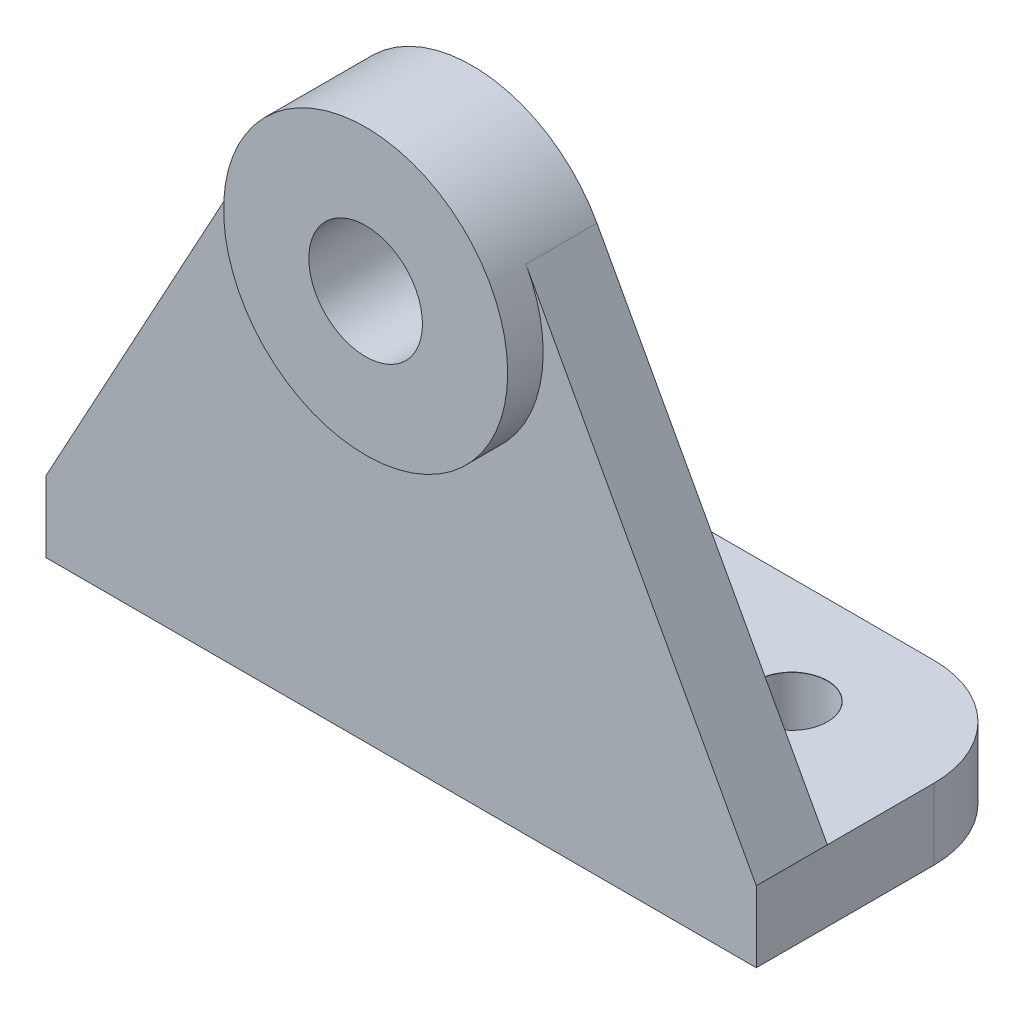
ISO-10303-21;
HEADER;
FILE_DESCRIPTION(('STEP AP214'),'2;1');
FILE_NAME('part.step','',(''),(''),'','','');
FILE_SCHEMA(('AUTOMOTIVE_DESIGN { 1 0 10303 214 1 1 1 1 }'));
ENDSEC;
DATA;
#1=APPLICATION_CONTEXT('core data for automotive mechanical design processes');
#2=APPLICATION_PROTOCOL_DEFINITION('international standard','automotive_design',2000,#1);
#3=PRODUCT_CONTEXT('',#1,'mechanical');
#4=PRODUCT('Part','Part','',(#3));
#5=PRODUCT_RELATED_PRODUCT_CATEGORY('part','',(#4));
#6=PRODUCT_DEFINITION_FORMATION('','',#4);
#7=PRODUCT_DEFINITION_CONTEXT('part definition',#1,'design');
#8=PRODUCT_DEFINITION('design','',#6,#7);
#9=PRODUCT_DEFINITION_SHAPE('','',#8);
#10=(LENGTH_UNIT() NAMED_UNIT(*) SI_UNIT(.MILLI.,.METRE.));
#11=(NAMED_UNIT(*) PLANE_ANGLE_UNIT() SI_UNIT($,.RADIAN.));
#12=(NAMED_UNIT(*) SI_UNIT($,.STERADIAN.) SOLID_ANGLE_UNIT());
#13=UNCERTAINTY_MEASURE_WITH_UNIT(LENGTH_MEASURE(1.E-05),#10,'distance_accuracy_value','');
#14=(GEOMETRIC_REPRESENTATION_CONTEXT(3) GLOBAL_UNCERTAINTY_ASSIGNED_CONTEXT((#13)) GLOBAL_UNIT_ASSIGNED_CONTEXT((#10,
#11,#12)) REPRESENTATION_CONTEXT('',''));
#15=CARTESIAN_POINT('',(0.,0.,0.));
#16=DIRECTION('',(0.,0.,1.));
#17=DIRECTION('',(1.,0.,0.));
#18=AXIS2_PLACEMENT_3D('',#15,#16,#17);
#19=CARTESIAN_POINT('',(0.,10.,0.));
#20=DIRECTION('',(0.,1.,0.));
#21=DIRECTION('',(0.,0.,1.));
#22=AXIS2_PLACEMENT_3D('',#19,#20,#21);
#23=PLANE('',#22);
#24=CARTESIAN_POINT('',(30.,10.,-5.));
#25=DIRECTION('',(0.,1.,0.));
#26=DIRECTION('',(0.,0.,1.));
#27=AXIS2_PLACEMENT_3D('',#24,#25,#26);
#28=CIRCLE('',#27,5.025);
#29=CARTESIAN_POINT('',(30.,10.,0.0250000000000007));
#30=VERTEX_POINT('',#29);
#31=EDGE_CURVE('E406',#30,#30,#28,.T.);
#32=ORIENTED_EDGE('',*,*,#31,.F.);
#33=EDGE_LOOP('',(#32));
#34=FACE_BOUND('',#33,.T.);
#35=CARTESIAN_POINT('',(-30.,10.,-5.));
#36=DIRECTION('',(0.,1.,0.));
#37=DIRECTION('',(0.,0.,1.));
#38=AXIS2_PLACEMENT_3D('',#35,#36,#37);
#39=CIRCLE('',#38,4.925);
#40=CARTESIAN_POINT('',(-30.,10.,-0.0750000000000021));
#41=VERTEX_POINT('',#40);
#42=EDGE_CURVE('E397',#41,#41,#39,.T.);
#43=ORIENTED_EDGE('',*,*,#42,.F.);
#44=EDGE_LOOP('',(#43));
#45=FACE_BOUND('',#44,.T.);
#46=DIRECTION('',(0.,0.,-1.));
#47=VECTOR('',#46,1.);
#48=CARTESIAN_POINT('',(50.,10.,20.));
#49=LINE('',#48,#47);
#50=CARTESIAN_POINT('',(50.,10.,10.));
#51=VERTEX_POINT('',#50);
#52=CARTESIAN_POINT('',(50.,10.,-5.00000000000001));
#53=VERTEX_POINT('',#52);
#54=EDGE_CURVE('E168',#51,#53,#49,.T.);
#55=ORIENTED_EDGE('',*,*,#54,.T.);
#56=CARTESIAN_POINT('',(35.,10.,-5.00000000000001));
#57=DIRECTION('',(0.,1.,0.));
#58=DIRECTION('',(0.,0.,1.));
#59=AXIS2_PLACEMENT_3D('',#56,#57,#58);
#60=CIRCLE('',#59,15.);
#61=CARTESIAN_POINT('',(35.,10.,-20.));
#62=VERTEX_POINT('',#61);
#63=EDGE_CURVE('E47',#53,#62,#60,.T.);
#64=ORIENTED_EDGE('',*,*,#63,.T.);
#65=DIRECTION('',(-1.,0.,0.));
#66=VECTOR('',#65,1.);
#67=CARTESIAN_POINT('',(50.,10.,-20.));
#68=LINE('',#67,#66);
#69=CARTESIAN_POINT('',(-35.,10.,-20.));
#70=VERTEX_POINT('',#69);
#71=EDGE_CURVE('E172',#62,#70,#68,.T.);
#72=ORIENTED_EDGE('',*,*,#71,.T.);
#73=CARTESIAN_POINT('',(-35.,10.,-5.));
#74=DIRECTION('',(0.,1.,0.));
#75=DIRECTION('',(0.,0.,1.));
#76=AXIS2_PLACEMENT_3D('',#73,#74,#75);
#77=CIRCLE('',#76,15.);
#78=CARTESIAN_POINT('',(-50.,10.,-5.));
#79=VERTEX_POINT('',#78);
#80=EDGE_CURVE('E54',#70,#79,#77,.T.);
#81=ORIENTED_EDGE('',*,*,#80,.T.);
#82=DIRECTION('',(0.,0.,1.));
#83=VECTOR('',#82,1.);
#84=CARTESIAN_POINT('',(-50.,10.,20.));
#85=LINE('',#84,#83);
#86=CARTESIAN_POINT('',(-50.,10.,10.));
#87=VERTEX_POINT('',#86);
#88=EDGE_CURVE('E166',#79,#87,#85,.T.);
#89=ORIENTED_EDGE('',*,*,#88,.T.);
#90=DIRECTION('',(1.,0.,0.));
#91=VECTOR('',#90,1.);
#92=CARTESIAN_POINT('',(-50.,10.,10.));
#93=LINE('',#92,#91);
#94=EDGE_CURVE('E153',#87,#51,#93,.T.);
#95=ORIENTED_EDGE('',*,*,#94,.T.);
#96=EDGE_LOOP('',(#55,#64,#72,#81,#89,#95));
#97=FACE_BOUND('',#96,.T.);
#98=ADVANCED_FACE('F39',(#34,#45,#97),#23,.T.);
#99=CARTESIAN_POINT('',(-50.,10.,20.));
#100=DIRECTION('',(1.,0.,0.));
#101=DIRECTION('',(0.,0.,-1.));
#102=AXIS2_PLACEMENT_3D('',#99,#100,#101);
#103=PLANE('',#102);
#104=ORIENTED_EDGE('',*,*,#88,.F.);
#105=DIRECTION('',(0.,-1.,0.));
#106=VECTOR('',#105,1.);
#107=CARTESIAN_POINT('',(-50.,10.,-5.));
#108=LINE('',#107,#106);
#109=CARTESIAN_POINT('',(-50.,0.,-5.));
#110=VERTEX_POINT('',#109);
#111=EDGE_CURVE('E11',#79,#110,#108,.T.);
#112=ORIENTED_EDGE('',*,*,#111,.T.);
#113=DIRECTION('',(0.,0.,1.));
#114=VECTOR('',#113,1.);
#115=CARTESIAN_POINT('',(-50.,0.,20.));
#116=LINE('',#115,#114);
#117=CARTESIAN_POINT('',(-50.,0.,20.));
#118=VERTEX_POINT('',#117);
#119=EDGE_CURVE('E164',#110,#118,#116,.T.);
#120=ORIENTED_EDGE('',*,*,#119,.T.);
#121=DIRECTION('',(0.,-1.,0.));
#122=VECTOR('',#121,1.);
#123=CARTESIAN_POINT('',(-50.,10.,20.));
#124=LINE('',#123,#122);
#125=CARTESIAN_POINT('',(-50.,10.,20.));
#126=VERTEX_POINT('',#125);
#127=EDGE_CURVE('E141',#126,#118,#124,.T.);
#128=ORIENTED_EDGE('',*,*,#127,.F.);
#129=DIRECTION('',(0.,0.,1.));
#130=VECTOR('',#129,1.);
#131=CARTESIAN_POINT('',(-50.,10.,10.));
#132=LINE('',#131,#130);
#133=EDGE_CURVE('E162',#87,#126,#132,.T.);
#134=ORIENTED_EDGE('',*,*,#133,.F.);
#135=EDGE_LOOP('',(#104,#112,#120,#128,#134));
#136=FACE_BOUND('',#135,.T.);
#137=ADVANCED_FACE('F212',(#136),#103,.F.);
#138=CARTESIAN_POINT('',(50.,10.,20.));
#139=DIRECTION('',(0.,0.,-1.));
#140=DIRECTION('',(-1.,0.,0.));
#141=AXIS2_PLACEMENT_3D('',#138,#139,#140);
#142=PLANE('',#141);
#143=CARTESIAN_POINT('',(0.,60.,20.));
#144=DIRECTION('',(0.,0.,1.));
#145=DIRECTION('',(1.,0.,0.));
#146=AXIS2_PLACEMENT_3D('',#143,#144,#145);
#147=CIRCLE('',#146,20.);
#148=CARTESIAN_POINT('',(-17.5646599662505,69.5646599662505,20.));
#149=VERTEX_POINT('',#148);
#150=CARTESIAN_POINT('',(17.5646599662505,69.5646599662506,20.));
#151=VERTEX_POINT('',#150);
#152=EDGE_CURVE('E117',#149,#151,#147,.T.);
#153=ORIENTED_EDGE('',*,*,#152,.F.);
#154=DIRECTION('',(-0.478232998312527,-0.878232998312527,0.));
#155=VECTOR('',#154,1.);
#156=CARTESIAN_POINT('',(-50.,10.,20.));
#157=LINE('',#156,#155);
#158=EDGE_CURVE('E124',#149,#126,#157,.T.);
#159=ORIENTED_EDGE('',*,*,#158,.T.);
#160=ORIENTED_EDGE('',*,*,#127,.T.);
#161=DIRECTION('',(1.,0.,0.));
#162=VECTOR('',#161,1.);
#163=CARTESIAN_POINT('',(50.,0.,20.));
#164=LINE('',#163,#162);
#165=CARTESIAN_POINT('',(50.,0.,20.));
#166=VERTEX_POINT('',#165);
#167=EDGE_CURVE('E175',#118,#166,#164,.T.);
#168=ORIENTED_EDGE('',*,*,#167,.T.);
#169=DIRECTION('',(0.,-1.,0.));
#170=VECTOR('',#169,1.);
#171=CARTESIAN_POINT('',(50.,10.,20.));
#172=LINE('',#171,#170);
#173=CARTESIAN_POINT('',(50.,10.,20.));
#174=VERTEX_POINT('',#173);
#175=EDGE_CURVE('E120',#174,#166,#172,.T.);
#176=ORIENTED_EDGE('',*,*,#175,.F.);
#177=DIRECTION('',(-0.478232998312527,0.878232998312527,0.));
#178=VECTOR('',#177,1.);
#179=CARTESIAN_POINT('',(50.,10.,20.));
#180=LINE('',#179,#178);
#181=EDGE_CURVE('E112',#174,#151,#180,.T.);
#182=ORIENTED_EDGE('',*,*,#181,.T.);
#183=EDGE_LOOP('',(#153,#159,#160,#168,#176,#182));
#184=FACE_BOUND('',#183,.T.);
#185=ADVANCED_FACE('F114',(#184),#142,.F.);
#186=CARTESIAN_POINT('',(50.,10.,20.));
#187=DIRECTION('',(-1.,0.,0.));
#188=DIRECTION('',(0.,0.,1.));
#189=AXIS2_PLACEMENT_3D('',#186,#187,#188);
#190=PLANE('',#189);
#191=DIRECTION('',(0.,0.,-1.));
#192=VECTOR('',#191,1.);
#193=CARTESIAN_POINT('',(50.,0.,20.));
#194=LINE('',#193,#192);
#195=CARTESIAN_POINT('',(50.,0.,-5.00000000000001));
#196=VERTEX_POINT('',#195);
#197=EDGE_CURVE('E177',#166,#196,#194,.T.);
#198=ORIENTED_EDGE('',*,*,#197,.T.);
#199=DIRECTION('',(0.,-1.,0.));
#200=VECTOR('',#199,1.);
#201=CARTESIAN_POINT('',(50.,10.,-5.00000000000001));
#202=LINE('',#201,#200);
#203=EDGE_CURVE('E62',#196,#53,#202,.F.);
#204=ORIENTED_EDGE('',*,*,#203,.T.);
#205=ORIENTED_EDGE('',*,*,#54,.F.);
#206=EDGE_CURVE('E170',#174,#51,#49,.T.);
#207=ORIENTED_EDGE('',*,*,#206,.F.);
#208=ORIENTED_EDGE('',*,*,#175,.T.);
#209=EDGE_LOOP('',(#198,#204,#205,#207,#208));
#210=FACE_BOUND('',#209,.T.);
#211=ADVANCED_FACE('F202',(#210),#190,.F.);
#212=CARTESIAN_POINT('',(50.,10.,-20.));
#213=DIRECTION('',(0.,0.,1.));
#214=DIRECTION('',(1.,0.,0.));
#215=AXIS2_PLACEMENT_3D('',#212,#213,#214);
#216=PLANE('',#215);
#217=ORIENTED_EDGE('',*,*,#71,.F.);
#218=DIRECTION('',(0.,-1.,0.));
#219=VECTOR('',#218,1.);
#220=CARTESIAN_POINT('',(35.,10.,-20.));
#221=LINE('',#220,#219);
#222=CARTESIAN_POINT('',(35.,0.,-20.));
#223=VERTEX_POINT('',#222);
#224=EDGE_CURVE('E143',#62,#223,#221,.T.);
#225=ORIENTED_EDGE('',*,*,#224,.T.);
#226=DIRECTION('',(-1.,0.,0.));
#227=VECTOR('',#226,1.);
#228=CARTESIAN_POINT('',(50.,0.,-20.));
#229=LINE('',#228,#227);
#230=CARTESIAN_POINT('',(-35.,0.,-20.));
#231=VERTEX_POINT('',#230);
#232=EDGE_CURVE('E169',#223,#231,#229,.T.);
#233=ORIENTED_EDGE('',*,*,#232,.T.);
#234=DIRECTION('',(0.,-1.,0.));
#235=VECTOR('',#234,1.);
#236=CARTESIAN_POINT('',(-35.,10.,-20.));
#237=LINE('',#236,#235);
#238=EDGE_CURVE('E140',#231,#70,#237,.F.);
#239=ORIENTED_EDGE('',*,*,#238,.T.);
#240=EDGE_LOOP('',(#217,#225,#233,#239));
#241=FACE_BOUND('',#240,.T.);
#242=ADVANCED_FACE('F194',(#241),#216,.F.);
#243=CARTESIAN_POINT('',(0.,0.,0.));
#244=DIRECTION('',(0.,1.,0.));
#245=DIRECTION('',(0.,0.,1.));
#246=AXIS2_PLACEMENT_3D('',#243,#244,#245);
#247=PLANE('',#246);
#248=CARTESIAN_POINT('',(30.,0.,-5.));
#249=DIRECTION('',(0.,1.,0.));
#250=DIRECTION('',(0.,0.,1.));
#251=AXIS2_PLACEMENT_3D('',#248,#249,#250);
#252=CIRCLE('',#251,5.);
#253=CARTESIAN_POINT('',(30.,0.,0.));
#254=VERTEX_POINT('',#253);
#255=EDGE_CURVE('E400',#254,#254,#252,.T.);
#256=ORIENTED_EDGE('',*,*,#255,.T.);
#257=EDGE_LOOP('',(#256));
#258=FACE_BOUND('',#257,.T.);
#259=CARTESIAN_POINT('',(-30.,0.,-5.));
#260=DIRECTION('',(0.,1.,0.));
#261=DIRECTION('',(0.,0.,1.));
#262=AXIS2_PLACEMENT_3D('',#259,#260,#261);
#263=CIRCLE('',#262,4.9);
#264=CARTESIAN_POINT('',(-30.,0.,-0.100000000000003));
#265=VERTEX_POINT('',#264);
#266=EDGE_CURVE('E389',#265,#265,#263,.T.);
#267=ORIENTED_EDGE('',*,*,#266,.T.);
#268=EDGE_LOOP('',(#267));
#269=FACE_BOUND('',#268,.T.);
#270=ORIENTED_EDGE('',*,*,#232,.F.);
#271=CARTESIAN_POINT('',(35.,0.,-5.00000000000001));
#272=DIRECTION('',(0.,1.,0.));
#273=DIRECTION('',(0.,0.,1.));
#274=AXIS2_PLACEMENT_3D('',#271,#272,#273);
#275=CIRCLE('',#274,15.);
#276=EDGE_CURVE('E186',#223,#196,#275,.F.);
#277=ORIENTED_EDGE('',*,*,#276,.T.);
#278=ORIENTED_EDGE('',*,*,#197,.F.);
#279=ORIENTED_EDGE('',*,*,#167,.F.);
#280=ORIENTED_EDGE('',*,*,#119,.F.);
#281=CARTESIAN_POINT('',(-35.,0.,-5.));
#282=DIRECTION('',(0.,1.,0.));
#283=DIRECTION('',(0.,0.,1.));
#284=AXIS2_PLACEMENT_3D('',#281,#282,#283);
#285=CIRCLE('',#284,15.);
#286=EDGE_CURVE('E184',#110,#231,#285,.F.);
#287=ORIENTED_EDGE('',*,*,#286,.T.);
#288=EDGE_LOOP('',(#270,#277,#278,#279,#280,#287));
#289=FACE_BOUND('',#288,.T.);
#290=ADVANCED_FACE('F200',(#258,#269,#289),#247,.F.);
#291=CARTESIAN_POINT('',(-50.,10.,10.));
#292=DIRECTION('',(-0.878232998312527,0.478232998312527,0.));
#293=DIRECTION('',(-0.478232998312527,-0.878232998312527,0.));
#294=AXIS2_PLACEMENT_3D('',#291,#292,#293);
#295=PLANE('',#294);
#296=ORIENTED_EDGE('',*,*,#158,.F.);
#297=DIRECTION('',(0.,0.,1.));
#298=VECTOR('',#297,1.);
#299=CARTESIAN_POINT('',(-17.5646599662505,69.5646599662505,10.));
#300=LINE('',#299,#298);
#301=CARTESIAN_POINT('',(-17.5646599662505,69.5646599662505,10.));
#302=VERTEX_POINT('',#301);
#303=EDGE_CURVE('E134',#302,#149,#300,.T.);
#304=ORIENTED_EDGE('',*,*,#303,.F.);
#305=DIRECTION('',(-0.478232998312527,-0.878232998312527,0.));
#306=VECTOR('',#305,1.);
#307=CARTESIAN_POINT('',(-50.,10.,10.));
#308=LINE('',#307,#306);
#309=EDGE_CURVE('E135',#302,#87,#308,.T.);
#310=ORIENTED_EDGE('',*,*,#309,.T.);
#311=ORIENTED_EDGE('',*,*,#133,.T.);
#312=EDGE_LOOP('',(#296,#304,#310,#311));
#313=FACE_BOUND('',#312,.T.);
#314=ADVANCED_FACE('F209',(#313),#295,.T.);
#315=CARTESIAN_POINT('',(0.,60.,10.));
#316=DIRECTION('',(0.,0.,1.));
#317=DIRECTION('',(1.,0.,0.));
#318=AXIS2_PLACEMENT_3D('',#315,#316,#317);
#319=CYLINDRICAL_SURFACE('',#318,20.);
#320=ORIENTED_EDGE('',*,*,#303,.T.);
#321=ORIENTED_EDGE('',*,*,#152,.T.);
#322=DIRECTION('',(0.,0.,1.));
#323=VECTOR('',#322,1.);
#324=CARTESIAN_POINT('',(17.5646599662505,69.5646599662505,10.));
#325=LINE('',#324,#323);
#326=CARTESIAN_POINT('',(17.5646599662505,69.5646599662505,10.));
#327=VERTEX_POINT('',#326);
#328=EDGE_CURVE('E128',#327,#151,#325,.T.);
#329=ORIENTED_EDGE('',*,*,#328,.F.);
#330=CARTESIAN_POINT('',(0.,60.,10.));
#331=DIRECTION('',(0.,0.,1.));
#332=DIRECTION('',(1.,0.,0.));
#333=AXIS2_PLACEMENT_3D('',#330,#331,#332);
#334=CIRCLE('',#333,20.);
#335=EDGE_CURVE('E157',#327,#302,#334,.T.);
#336=ORIENTED_EDGE('',*,*,#335,.T.);
#337=EDGE_LOOP('',(#320,#321,#329,#336));
#338=FACE_BOUND('',#337,.T.);
#339=CARTESIAN_POINT('',(0.,60.,25.));
#340=DIRECTION('',(0.,0.,1.));
#341=DIRECTION('',(1.,0.,0.));
#342=AXIS2_PLACEMENT_3D('',#339,#340,#341);
#343=CIRCLE('',#342,20.);
#344=CARTESIAN_POINT('',(20.,60.,25.));
#345=VERTEX_POINT('',#344);
#346=EDGE_CURVE('E149',#345,#345,#343,.T.);
#347=ORIENTED_EDGE('',*,*,#346,.F.);
#348=EDGE_LOOP('',(#347));
#349=FACE_BOUND('',#348,.T.);
#350=ADVANCED_FACE('F137',(#338,#349),#319,.T.);
#351=CARTESIAN_POINT('',(50.,10.,10.));
#352=DIRECTION('',(0.878232998312527,0.478232998312527,0.));
#353=DIRECTION('',(-0.478232998312527,0.878232998312527,0.));
#354=AXIS2_PLACEMENT_3D('',#351,#352,#353);
#355=PLANE('',#354);
#356=ORIENTED_EDGE('',*,*,#181,.F.);
#357=ORIENTED_EDGE('',*,*,#206,.T.);
#358=DIRECTION('',(-0.478232998312527,0.878232998312527,0.));
#359=VECTOR('',#358,1.);
#360=CARTESIAN_POINT('',(50.,10.,10.));
#361=LINE('',#360,#359);
#362=EDGE_CURVE('E130',#51,#327,#361,.T.);
#363=ORIENTED_EDGE('',*,*,#362,.T.);
#364=ORIENTED_EDGE('',*,*,#328,.T.);
#365=EDGE_LOOP('',(#356,#357,#363,#364));
#366=FACE_BOUND('',#365,.T.);
#367=ADVANCED_FACE('F129',(#366),#355,.T.);
#368=CARTESIAN_POINT('',(0.,60.,10.));
#369=DIRECTION('',(0.,0.,1.));
#370=DIRECTION('',(1.,0.,0.));
#371=AXIS2_PLACEMENT_3D('',#368,#369,#370);
#372=PLANE('',#371);
#373=CARTESIAN_POINT('',(0.,60.,10.));
#374=DIRECTION('',(0.,0.,1.));
#375=DIRECTION('',(1.,0.,0.));
#376=AXIS2_PLACEMENT_3D('',#373,#374,#375);
#377=CIRCLE('',#376,8.);
#378=CARTESIAN_POINT('',(8.,60.,10.));
#379=VERTEX_POINT('',#378);
#380=EDGE_CURVE('E125',#379,#379,#377,.T.);
#381=ORIENTED_EDGE('',*,*,#380,.T.);
#382=EDGE_LOOP('',(#381));
#383=FACE_BOUND('',#382,.T.);
#384=ORIENTED_EDGE('',*,*,#94,.F.);
#385=ORIENTED_EDGE('',*,*,#309,.F.);
#386=ORIENTED_EDGE('',*,*,#335,.F.);
#387=ORIENTED_EDGE('',*,*,#362,.F.);
#388=EDGE_LOOP('',(#384,#385,#386,#387));
#389=FACE_BOUND('',#388,.T.);
#390=ADVANCED_FACE('F206',(#383,#389),#372,.F.);
#391=CARTESIAN_POINT('',(0.,60.,10.));
#392=DIRECTION('',(0.,0.,1.));
#393=DIRECTION('',(1.,0.,0.));
#394=AXIS2_PLACEMENT_3D('',#391,#392,#393);
#395=CYLINDRICAL_SURFACE('',#394,8.);
#396=ORIENTED_EDGE('',*,*,#380,.F.);
#397=EDGE_LOOP('',(#396));
#398=FACE_BOUND('',#397,.T.);
#399=CARTESIAN_POINT('',(0.,60.,25.));
#400=DIRECTION('',(0.,0.,1.));
#401=DIRECTION('',(1.,0.,0.));
#402=AXIS2_PLACEMENT_3D('',#399,#400,#401);
#403=CIRCLE('',#402,7.99999999999999);
#404=CARTESIAN_POINT('',(8.,60.,25.));
#405=VERTEX_POINT('',#404);
#406=EDGE_CURVE('E387',#405,#405,#403,.T.);
#407=ORIENTED_EDGE('',*,*,#406,.T.);
#408=EDGE_LOOP('',(#407));
#409=FACE_BOUND('',#408,.T.);
#410=ADVANCED_FACE('F268',(#398,#409),#395,.F.);
#411=CARTESIAN_POINT('',(0.,60.,25.));
#412=DIRECTION('',(0.,0.,1.));
#413=DIRECTION('',(1.,0.,0.));
#414=AXIS2_PLACEMENT_3D('',#411,#412,#413);
#415=PLANE('',#414);
#416=ORIENTED_EDGE('',*,*,#346,.T.);
#417=EDGE_LOOP('',(#416));
#418=FACE_BOUND('',#417,.T.);
#419=ORIENTED_EDGE('',*,*,#406,.F.);
#420=EDGE_LOOP('',(#419));
#421=FACE_BOUND('',#420,.T.);
#422=ADVANCED_FACE('F271',(#418,#421),#415,.T.);
#423=CARTESIAN_POINT('',(-30.,10.,-5.));
#424=DIRECTION('',(0.,1.,0.));
#425=DIRECTION('',(0.,0.,1.));
#426=AXIS2_PLACEMENT_3D('',#423,#424,#425);
#427=CYLINDRICAL_SURFACE('',#426,4.9);
#428=ORIENTED_EDGE('',*,*,#266,.F.);
#429=EDGE_LOOP('',(#428));
#430=FACE_BOUND('',#429,.T.);
#431=CARTESIAN_POINT('',(-30.,9.97902250922057,-5.));
#432=DIRECTION('',(0.,1.,0.));
#433=DIRECTION('',(0.,0.,1.));
#434=AXIS2_PLACEMENT_3D('',#431,#432,#433);
#435=CIRCLE('',#434,4.9);
#436=CARTESIAN_POINT('',(-30.,9.97902250922057,-0.100000000000003));
#437=VERTEX_POINT('',#436);
#438=EDGE_CURVE('E392',#437,#437,#435,.T.);
#439=ORIENTED_EDGE('',*,*,#438,.T.);
#440=EDGE_LOOP('',(#439));
#441=FACE_BOUND('',#440,.T.);
#442=ADVANCED_FACE('F279',(#430,#441),#427,.F.);
#443=CARTESIAN_POINT('',(-30.,10.,-5.));
#444=DIRECTION('',(0.,1.,0.));
#445=DIRECTION('',(0.,0.,1.));
#446=AXIS2_PLACEMENT_3D('',#443,#444,#445);
#447=CONICAL_SURFACE('',#446,4.925,0.872664625997199);
#448=ORIENTED_EDGE('',*,*,#438,.F.);
#449=EDGE_LOOP('',(#448));
#450=FACE_BOUND('',#449,.T.);
#451=ORIENTED_EDGE('',*,*,#42,.T.);
#452=EDGE_LOOP('',(#451));
#453=FACE_BOUND('',#452,.T.);
#454=ADVANCED_FACE('F288',(#450,#453),#447,.F.);
#455=CARTESIAN_POINT('',(30.,10.,-5.));
#456=DIRECTION('',(0.,1.,0.));
#457=DIRECTION('',(0.,0.,1.));
#458=AXIS2_PLACEMENT_3D('',#455,#456,#457);
#459=CYLINDRICAL_SURFACE('',#458,5.);
#460=ORIENTED_EDGE('',*,*,#255,.F.);
#461=EDGE_LOOP('',(#460));
#462=FACE_BOUND('',#461,.T.);
#463=CARTESIAN_POINT('',(30.,9.97902250922056,-5.));
#464=DIRECTION('',(0.,1.,0.));
#465=DIRECTION('',(0.,0.,1.));
#466=AXIS2_PLACEMENT_3D('',#463,#464,#465);
#467=CIRCLE('',#466,5.);
#468=CARTESIAN_POINT('',(30.,9.97902250922056,0.));
#469=VERTEX_POINT('',#468);
#470=EDGE_CURVE('E403',#469,#469,#467,.T.);
#471=ORIENTED_EDGE('',*,*,#470,.T.);
#472=EDGE_LOOP('',(#471));
#473=FACE_BOUND('',#472,.T.);
#474=ADVANCED_FACE('F297',(#462,#473),#459,.F.);
#475=CARTESIAN_POINT('',(30.,10.,-5.));
#476=DIRECTION('',(0.,1.,0.));
#477=DIRECTION('',(0.,0.,1.));
#478=AXIS2_PLACEMENT_3D('',#475,#476,#477);
#479=CONICAL_SURFACE('',#478,5.025,0.872664625997145);
#480=ORIENTED_EDGE('',*,*,#470,.F.);
#481=EDGE_LOOP('',(#480));
#482=FACE_BOUND('',#481,.T.);
#483=ORIENTED_EDGE('',*,*,#31,.T.);
#484=EDGE_LOOP('',(#483));
#485=FACE_BOUND('',#484,.T.);
#486=ADVANCED_FACE('F220',(#482,#485),#479,.F.);
#487=CARTESIAN_POINT('',(35.,10.,-5.00000000000001));
#488=DIRECTION('',(0.,-1.,0.));
#489=DIRECTION('',(0.,0.,-1.));
#490=AXIS2_PLACEMENT_3D('',#487,#488,#489);
#491=CYLINDRICAL_SURFACE('',#490,15.);
#492=ORIENTED_EDGE('',*,*,#63,.F.);
#493=ORIENTED_EDGE('',*,*,#203,.F.);
#494=ORIENTED_EDGE('',*,*,#276,.F.);
#495=ORIENTED_EDGE('',*,*,#224,.F.);
#496=EDGE_LOOP('',(#492,#493,#494,#495));
#497=FACE_BOUND('',#496,.T.);
#498=ADVANCED_FACE('F197',(#497),#491,.T.);
#499=CARTESIAN_POINT('',(-35.,10.,-5.));
#500=DIRECTION('',(0.,-1.,0.));
#501=DIRECTION('',(0.,0.,-1.));
#502=AXIS2_PLACEMENT_3D('',#499,#500,#501);
#503=CYLINDRICAL_SURFACE('',#502,15.);
#504=ORIENTED_EDGE('',*,*,#80,.F.);
#505=ORIENTED_EDGE('',*,*,#238,.F.);
#506=ORIENTED_EDGE('',*,*,#286,.F.);
#507=ORIENTED_EDGE('',*,*,#111,.F.);
#508=EDGE_LOOP('',(#504,#505,#506,#507));
#509=FACE_BOUND('',#508,.T.);
#510=ADVANCED_FACE('F41',(#509),#503,.T.);
#511=CLOSED_SHELL('',(#98,#137,#185,#211,#242,#290,#314,#350,#367,#390,#410,#422,#442,#454,#474,
#486,#498,#510));
#512=MANIFOLD_SOLID_BREP('B2',#511);
#513=ADVANCED_BREP_SHAPE_REPRESENTATION('',(#18,#512),#14);
#514=SHAPE_DEFINITION_REPRESENTATION(#9,#513);
ENDSEC;
END-ISO-10303-21;
